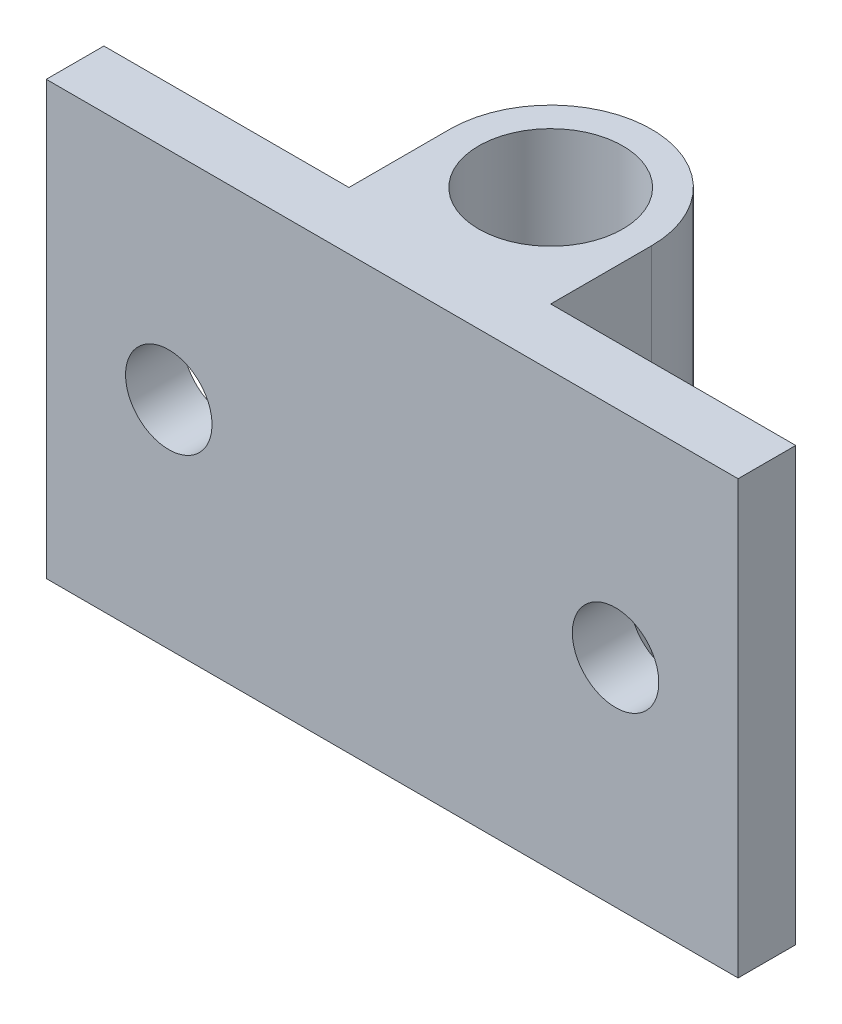
ISO-10303-21;
HEADER;
FILE_DESCRIPTION(('STEP AP214'),'2;1');
FILE_NAME('part.step','',(''),(''),'','','');
FILE_SCHEMA(('AUTOMOTIVE_DESIGN { 1 0 10303 214 1 1 1 1 }'));
ENDSEC;
DATA;
#1=APPLICATION_CONTEXT('core data for automotive mechanical design processes');
#2=APPLICATION_PROTOCOL_DEFINITION('international standard','automotive_design',2000,#1);
#3=PRODUCT_CONTEXT('',#1,'mechanical');
#4=PRODUCT('Part','Part','',(#3));
#5=PRODUCT_RELATED_PRODUCT_CATEGORY('part','',(#4));
#6=PRODUCT_DEFINITION_FORMATION('','',#4);
#7=PRODUCT_DEFINITION_CONTEXT('part definition',#1,'design');
#8=PRODUCT_DEFINITION('design','',#6,#7);
#9=PRODUCT_DEFINITION_SHAPE('','',#8);
#10=(LENGTH_UNIT() NAMED_UNIT(*) SI_UNIT(.MILLI.,.METRE.));
#11=(NAMED_UNIT(*) PLANE_ANGLE_UNIT() SI_UNIT($,.RADIAN.));
#12=(NAMED_UNIT(*) SI_UNIT($,.STERADIAN.) SOLID_ANGLE_UNIT());
#13=UNCERTAINTY_MEASURE_WITH_UNIT(LENGTH_MEASURE(1.E-05),#10,'distance_accuracy_value','');
#14=(GEOMETRIC_REPRESENTATION_CONTEXT(3) GLOBAL_UNCERTAINTY_ASSIGNED_CONTEXT((#13)) GLOBAL_UNIT_ASSIGNED_CONTEXT((#10,
#11,#12)) REPRESENTATION_CONTEXT('',''));
#15=CARTESIAN_POINT('',(0.,0.,0.));
#16=DIRECTION('',(0.,0.,1.));
#17=DIRECTION('',(1.,0.,0.));
#18=AXIS2_PLACEMENT_3D('',#15,#16,#17);
#19=CARTESIAN_POINT('',(0.,15.,0.));
#20=DIRECTION('',(0.,-1.,0.));
#21=DIRECTION('',(0.,0.,-1.));
#22=AXIS2_PLACEMENT_3D('',#19,#20,#21);
#23=CYLINDRICAL_SURFACE('',#22,3.5);
#24=CARTESIAN_POINT('',(0.,0.,0.));
#25=DIRECTION('',(0.,1.,0.));
#26=DIRECTION('',(0.,0.,1.));
#27=AXIS2_PLACEMENT_3D('',#24,#25,#26);
#28=CIRCLE('',#27,3.5);
#29=CARTESIAN_POINT('',(-3.5,0.,0.));
#30=VERTEX_POINT('',#29);
#31=CARTESIAN_POINT('',(3.5,0.,0.));
#32=VERTEX_POINT('',#31);
#33=EDGE_CURVE('E132',#30,#32,#28,.F.);
#34=ORIENTED_EDGE('',*,*,#33,.F.);
#35=DIRECTION('',(0.,-1.,0.));
#36=VECTOR('',#35,1.);
#37=CARTESIAN_POINT('',(-3.5,15.,0.));
#38=LINE('',#37,#36);
#39=CARTESIAN_POINT('',(-3.5,15.,0.));
#40=VERTEX_POINT('',#39);
#41=EDGE_CURVE('E11',#40,#30,#38,.T.);
#42=ORIENTED_EDGE('',*,*,#41,.F.);
#43=CARTESIAN_POINT('',(0.,15.,0.));
#44=DIRECTION('',(0.,1.,0.));
#45=DIRECTION('',(0.,0.,1.));
#46=AXIS2_PLACEMENT_3D('',#43,#44,#45);
#47=CIRCLE('',#46,3.5);
#48=CARTESIAN_POINT('',(3.5,15.,0.));
#49=VERTEX_POINT('',#48);
#50=EDGE_CURVE('E154',#40,#49,#47,.F.);
#51=ORIENTED_EDGE('',*,*,#50,.T.);
#52=DIRECTION('',(0.,-1.,0.));
#53=VECTOR('',#52,1.);
#54=CARTESIAN_POINT('',(3.5,15.,0.));
#55=LINE('',#54,#53);
#56=EDGE_CURVE('E49',#49,#32,#55,.T.);
#57=ORIENTED_EDGE('',*,*,#56,.T.);
#58=EDGE_LOOP('',(#34,#42,#51,#57));
#59=FACE_BOUND('',#58,.T.);
#60=ADVANCED_FACE('F33',(#59),#23,.T.);
#61=CARTESIAN_POINT('',(-3.5,15.,0.));
#62=DIRECTION('',(1.,0.,0.));
#63=DIRECTION('',(0.,0.,-1.));
#64=AXIS2_PLACEMENT_3D('',#61,#62,#63);
#65=PLANE('',#64);
#66=DIRECTION('',(0.,0.,1.));
#67=VECTOR('',#66,1.);
#68=CARTESIAN_POINT('',(-3.5,0.,0.));
#69=LINE('',#68,#67);
#70=CARTESIAN_POINT('',(-3.5,0.,3.5));
#71=VERTEX_POINT('',#70);
#72=EDGE_CURVE('E134',#30,#71,#69,.T.);
#73=ORIENTED_EDGE('',*,*,#72,.T.);
#74=DIRECTION('',(0.,-1.,0.));
#75=VECTOR('',#74,1.);
#76=CARTESIAN_POINT('',(-3.5,15.,3.5));
#77=LINE('',#76,#75);
#78=CARTESIAN_POINT('',(-3.5,15.,3.5));
#79=VERTEX_POINT('',#78);
#80=EDGE_CURVE('E41',#79,#71,#77,.T.);
#81=ORIENTED_EDGE('',*,*,#80,.F.);
#82=DIRECTION('',(0.,0.,1.));
#83=VECTOR('',#82,1.);
#84=CARTESIAN_POINT('',(-3.5,15.,0.));
#85=LINE('',#84,#83);
#86=EDGE_CURVE('E181',#40,#79,#85,.T.);
#87=ORIENTED_EDGE('',*,*,#86,.F.);
#88=ORIENTED_EDGE('',*,*,#41,.T.);
#89=EDGE_LOOP('',(#73,#81,#87,#88));
#90=FACE_BOUND('',#89,.T.);
#91=ADVANCED_FACE('F219',(#90),#65,.F.);
#92=CARTESIAN_POINT('',(0.,15.,3.5));
#93=DIRECTION('',(0.,0.,1.));
#94=DIRECTION('',(1.,0.,0.));
#95=AXIS2_PLACEMENT_3D('',#92,#93,#94);
#96=PLANE('',#95);
#97=CARTESIAN_POINT('',(-7.75,7.5,3.5));
#98=DIRECTION('',(0.,0.,-1.));
#99=DIRECTION('',(-1.,0.,0.));
#100=AXIS2_PLACEMENT_3D('',#97,#98,#99);
#101=CIRCLE('',#100,1.5);
#102=CARTESIAN_POINT('',(-9.25,7.5,3.5));
#103=VERTEX_POINT('',#102);
#104=EDGE_CURVE('E186',#103,#103,#101,.T.);
#105=ORIENTED_EDGE('',*,*,#104,.F.);
#106=EDGE_LOOP('',(#105));
#107=FACE_BOUND('',#106,.T.);
#108=DIRECTION('',(-1.,0.,0.));
#109=VECTOR('',#108,1.);
#110=CARTESIAN_POINT('',(0.,0.,3.5));
#111=LINE('',#110,#109);
#112=CARTESIAN_POINT('',(-12.,0.,3.5));
#113=VERTEX_POINT('',#112);
#114=EDGE_CURVE('E137',#71,#113,#111,.T.);
#115=ORIENTED_EDGE('',*,*,#114,.T.);
#116=DIRECTION('',(0.,-1.,0.));
#117=VECTOR('',#116,1.);
#118=CARTESIAN_POINT('',(-12.,15.,3.5));
#119=LINE('',#118,#117);
#120=CARTESIAN_POINT('',(-12.,15.,3.5));
#121=VERTEX_POINT('',#120);
#122=EDGE_CURVE('E160',#121,#113,#119,.T.);
#123=ORIENTED_EDGE('',*,*,#122,.F.);
#124=DIRECTION('',(-1.,0.,0.));
#125=VECTOR('',#124,1.);
#126=CARTESIAN_POINT('',(0.,15.,3.5));
#127=LINE('',#126,#125);
#128=EDGE_CURVE('E168',#79,#121,#127,.T.);
#129=ORIENTED_EDGE('',*,*,#128,.F.);
#130=ORIENTED_EDGE('',*,*,#80,.T.);
#131=EDGE_LOOP('',(#115,#123,#129,#130));
#132=FACE_BOUND('',#131,.T.);
#133=ADVANCED_FACE('F166',(#107,#132),#96,.F.);
#134=CARTESIAN_POINT('',(-12.,15.,0.));
#135=DIRECTION('',(-1.,0.,0.));
#136=DIRECTION('',(0.,0.,1.));
#137=AXIS2_PLACEMENT_3D('',#134,#135,#136);
#138=PLANE('',#137);
#139=DIRECTION('',(0.,0.,-1.));
#140=VECTOR('',#139,1.);
#141=CARTESIAN_POINT('',(-12.,0.,0.));
#142=LINE('',#141,#140);
#143=CARTESIAN_POINT('',(-12.,0.,5.5));
#144=VERTEX_POINT('',#143);
#145=EDGE_CURVE('E140',#144,#113,#142,.T.);
#146=ORIENTED_EDGE('',*,*,#145,.F.);
#147=DIRECTION('',(0.,-1.,0.));
#148=VECTOR('',#147,1.);
#149=CARTESIAN_POINT('',(-12.,15.,5.5));
#150=LINE('',#149,#148);
#151=CARTESIAN_POINT('',(-12.,15.,5.5));
#152=VERTEX_POINT('',#151);
#153=EDGE_CURVE('E158',#152,#144,#150,.T.);
#154=ORIENTED_EDGE('',*,*,#153,.F.);
#155=DIRECTION('',(0.,0.,-1.));
#156=VECTOR('',#155,1.);
#157=CARTESIAN_POINT('',(-12.,15.,0.));
#158=LINE('',#157,#156);
#159=EDGE_CURVE('E179',#152,#121,#158,.T.);
#160=ORIENTED_EDGE('',*,*,#159,.T.);
#161=ORIENTED_EDGE('',*,*,#122,.T.);
#162=EDGE_LOOP('',(#146,#154,#160,#161));
#163=FACE_BOUND('',#162,.T.);
#164=ADVANCED_FACE('F177',(#163),#138,.T.);
#165=CARTESIAN_POINT('',(0.,15.,5.5));
#166=DIRECTION('',(0.,0.,-1.));
#167=DIRECTION('',(-1.,0.,0.));
#168=AXIS2_PLACEMENT_3D('',#165,#166,#167);
#169=PLANE('',#168);
#170=CARTESIAN_POINT('',(7.75,7.5,5.50000000000001));
#171=DIRECTION('',(0.,0.,-1.));
#172=DIRECTION('',(-1.,0.,0.));
#173=AXIS2_PLACEMENT_3D('',#170,#171,#172);
#174=CIRCLE('',#173,1.5);
#175=CARTESIAN_POINT('',(6.25,7.5,5.50000000000001));
#176=VERTEX_POINT('',#175);
#177=EDGE_CURVE('E135',#176,#176,#174,.T.);
#178=ORIENTED_EDGE('',*,*,#177,.T.);
#179=EDGE_LOOP('',(#178));
#180=FACE_BOUND('',#179,.T.);
#181=CARTESIAN_POINT('',(-7.75,7.5,5.5));
#182=DIRECTION('',(0.,0.,-1.));
#183=DIRECTION('',(-1.,0.,0.));
#184=AXIS2_PLACEMENT_3D('',#181,#182,#183);
#185=CIRCLE('',#184,1.5);
#186=CARTESIAN_POINT('',(-9.25,7.5,5.5));
#187=VERTEX_POINT('',#186);
#188=EDGE_CURVE('E189',#187,#187,#185,.T.);
#189=ORIENTED_EDGE('',*,*,#188,.T.);
#190=EDGE_LOOP('',(#189));
#191=FACE_BOUND('',#190,.T.);
#192=DIRECTION('',(1.,0.,0.));
#193=VECTOR('',#192,1.);
#194=CARTESIAN_POINT('',(0.,0.,5.5));
#195=LINE('',#194,#193);
#196=CARTESIAN_POINT('',(12.,0.,5.5));
#197=VERTEX_POINT('',#196);
#198=EDGE_CURVE('E143',#144,#197,#195,.T.);
#199=ORIENTED_EDGE('',*,*,#198,.T.);
#200=DIRECTION('',(0.,-1.,0.));
#201=VECTOR('',#200,1.);
#202=CARTESIAN_POINT('',(12.,15.,5.5));
#203=LINE('',#202,#201);
#204=CARTESIAN_POINT('',(12.,15.,5.5));
#205=VERTEX_POINT('',#204);
#206=EDGE_CURVE('E121',#205,#197,#203,.T.);
#207=ORIENTED_EDGE('',*,*,#206,.F.);
#208=DIRECTION('',(1.,0.,0.));
#209=VECTOR('',#208,1.);
#210=CARTESIAN_POINT('',(0.,15.,5.5));
#211=LINE('',#210,#209);
#212=EDGE_CURVE('E109',#152,#205,#211,.T.);
#213=ORIENTED_EDGE('',*,*,#212,.F.);
#214=ORIENTED_EDGE('',*,*,#153,.T.);
#215=EDGE_LOOP('',(#199,#207,#213,#214));
#216=FACE_BOUND('',#215,.T.);
#217=ADVANCED_FACE('F198',(#180,#191,#216),#169,.F.);
#218=CARTESIAN_POINT('',(12.,15.,0.));
#219=DIRECTION('',(-1.,0.,0.));
#220=DIRECTION('',(0.,0.,1.));
#221=AXIS2_PLACEMENT_3D('',#218,#219,#220);
#222=PLANE('',#221);
#223=DIRECTION('',(0.,0.,-1.));
#224=VECTOR('',#223,1.);
#225=CARTESIAN_POINT('',(12.,0.,0.));
#226=LINE('',#225,#224);
#227=CARTESIAN_POINT('',(12.,0.,3.5));
#228=VERTEX_POINT('',#227);
#229=EDGE_CURVE('E118',#197,#228,#226,.T.);
#230=ORIENTED_EDGE('',*,*,#229,.T.);
#231=DIRECTION('',(0.,-1.,0.));
#232=VECTOR('',#231,1.);
#233=CARTESIAN_POINT('',(12.,15.,3.5));
#234=LINE('',#233,#232);
#235=CARTESIAN_POINT('',(12.,15.,3.5));
#236=VERTEX_POINT('',#235);
#237=EDGE_CURVE('E115',#236,#228,#234,.T.);
#238=ORIENTED_EDGE('',*,*,#237,.F.);
#239=DIRECTION('',(0.,0.,-1.));
#240=VECTOR('',#239,1.);
#241=CARTESIAN_POINT('',(12.,15.,0.));
#242=LINE('',#241,#240);
#243=EDGE_CURVE('E99',#205,#236,#242,.T.);
#244=ORIENTED_EDGE('',*,*,#243,.F.);
#245=ORIENTED_EDGE('',*,*,#206,.T.);
#246=EDGE_LOOP('',(#230,#238,#244,#245));
#247=FACE_BOUND('',#246,.T.);
#248=ADVANCED_FACE('F116',(#247),#222,.F.);
#249=CARTESIAN_POINT('',(0.,15.,3.5));
#250=DIRECTION('',(0.,0.,1.));
#251=DIRECTION('',(1.,0.,0.));
#252=AXIS2_PLACEMENT_3D('',#249,#250,#251);
#253=PLANE('',#252);
#254=CARTESIAN_POINT('',(7.75,7.5,3.50000000000001));
#255=DIRECTION('',(0.,0.,-1.));
#256=DIRECTION('',(-1.,0.,0.));
#257=AXIS2_PLACEMENT_3D('',#254,#255,#256);
#258=CIRCLE('',#257,1.5);
#259=CARTESIAN_POINT('',(6.25,7.5,3.50000000000001));
#260=VERTEX_POINT('',#259);
#261=EDGE_CURVE('E192',#260,#260,#258,.T.);
#262=ORIENTED_EDGE('',*,*,#261,.F.);
#263=EDGE_LOOP('',(#262));
#264=FACE_BOUND('',#263,.T.);
#265=DIRECTION('',(-1.,0.,0.));
#266=VECTOR('',#265,1.);
#267=CARTESIAN_POINT('',(0.,0.,3.5));
#268=LINE('',#267,#266);
#269=CARTESIAN_POINT('',(3.5,0.,3.5));
#270=VERTEX_POINT('',#269);
#271=EDGE_CURVE('E146',#228,#270,#268,.T.);
#272=ORIENTED_EDGE('',*,*,#271,.T.);
#273=DIRECTION('',(0.,-1.,0.));
#274=VECTOR('',#273,1.);
#275=CARTESIAN_POINT('',(3.5,15.,3.5));
#276=LINE('',#275,#274);
#277=CARTESIAN_POINT('',(3.5,15.,3.5));
#278=VERTEX_POINT('',#277);
#279=EDGE_CURVE('E75',#278,#270,#276,.T.);
#280=ORIENTED_EDGE('',*,*,#279,.F.);
#281=DIRECTION('',(-1.,0.,0.));
#282=VECTOR('',#281,1.);
#283=CARTESIAN_POINT('',(0.,15.,3.5));
#284=LINE('',#283,#282);
#285=EDGE_CURVE('E106',#236,#278,#284,.T.);
#286=ORIENTED_EDGE('',*,*,#285,.F.);
#287=ORIENTED_EDGE('',*,*,#237,.T.);
#288=EDGE_LOOP('',(#272,#280,#286,#287));
#289=FACE_BOUND('',#288,.T.);
#290=ADVANCED_FACE('F123',(#264,#289),#253,.F.);
#291=CARTESIAN_POINT('',(3.5,15.,0.));
#292=DIRECTION('',(1.,0.,0.));
#293=DIRECTION('',(0.,0.,-1.));
#294=AXIS2_PLACEMENT_3D('',#291,#292,#293);
#295=PLANE('',#294);
#296=DIRECTION('',(0.,0.,1.));
#297=VECTOR('',#296,1.);
#298=CARTESIAN_POINT('',(3.5,0.,0.));
#299=LINE('',#298,#297);
#300=EDGE_CURVE('E148',#32,#270,#299,.T.);
#301=ORIENTED_EDGE('',*,*,#300,.F.);
#302=ORIENTED_EDGE('',*,*,#56,.F.);
#303=DIRECTION('',(0.,0.,1.));
#304=VECTOR('',#303,1.);
#305=CARTESIAN_POINT('',(3.5,15.,0.));
#306=LINE('',#305,#304);
#307=EDGE_CURVE('E124',#49,#278,#306,.T.);
#308=ORIENTED_EDGE('',*,*,#307,.T.);
#309=ORIENTED_EDGE('',*,*,#279,.T.);
#310=EDGE_LOOP('',(#301,#302,#308,#309));
#311=FACE_BOUND('',#310,.T.);
#312=ADVANCED_FACE('F209',(#311),#295,.T.);
#313=CARTESIAN_POINT('',(0.,15.,0.));
#314=DIRECTION('',(0.,-1.,0.));
#315=DIRECTION('',(0.,0.,-1.));
#316=AXIS2_PLACEMENT_3D('',#313,#314,#315);
#317=CYLINDRICAL_SURFACE('',#316,2.5);
#318=CARTESIAN_POINT('',(0.,15.,0.));
#319=DIRECTION('',(0.,1.,0.));
#320=DIRECTION('',(0.,0.,1.));
#321=AXIS2_PLACEMENT_3D('',#318,#319,#320);
#322=CIRCLE('',#321,2.5);
#323=CARTESIAN_POINT('',(0.,15.,2.5));
#324=VERTEX_POINT('',#323);
#325=EDGE_CURVE('E126',#324,#324,#322,.T.);
#326=ORIENTED_EDGE('',*,*,#325,.T.);
#327=EDGE_LOOP('',(#326));
#328=FACE_BOUND('',#327,.T.);
#329=CARTESIAN_POINT('',(0.,0.,0.));
#330=DIRECTION('',(0.,1.,0.));
#331=DIRECTION('',(0.,0.,1.));
#332=AXIS2_PLACEMENT_3D('',#329,#330,#331);
#333=CIRCLE('',#332,2.5);
#334=CARTESIAN_POINT('',(0.,0.,2.5));
#335=VERTEX_POINT('',#334);
#336=EDGE_CURVE('E151',#335,#335,#333,.T.);
#337=ORIENTED_EDGE('',*,*,#336,.F.);
#338=EDGE_LOOP('',(#337));
#339=FACE_BOUND('',#338,.T.);
#340=ADVANCED_FACE('F215',(#328,#339),#317,.F.);
#341=CARTESIAN_POINT('',(0.,15.,0.));
#342=DIRECTION('',(0.,1.,0.));
#343=DIRECTION('',(0.,0.,1.));
#344=AXIS2_PLACEMENT_3D('',#341,#342,#343);
#345=PLANE('',#344);
#346=ORIENTED_EDGE('',*,*,#50,.F.);
#347=ORIENTED_EDGE('',*,*,#86,.T.);
#348=ORIENTED_EDGE('',*,*,#128,.T.);
#349=ORIENTED_EDGE('',*,*,#159,.F.);
#350=ORIENTED_EDGE('',*,*,#212,.T.);
#351=ORIENTED_EDGE('',*,*,#243,.T.);
#352=ORIENTED_EDGE('',*,*,#285,.T.);
#353=ORIENTED_EDGE('',*,*,#307,.F.);
#354=EDGE_LOOP('',(#346,#347,#348,#349,#350,#351,#352,#353));
#355=FACE_BOUND('',#354,.T.);
#356=ORIENTED_EDGE('',*,*,#325,.F.);
#357=EDGE_LOOP('',(#356));
#358=FACE_BOUND('',#357,.T.);
#359=ADVANCED_FACE('F102',(#355,#358),#345,.T.);
#360=CARTESIAN_POINT('',(0.,0.,0.));
#361=DIRECTION('',(0.,1.,0.));
#362=DIRECTION('',(0.,0.,1.));
#363=AXIS2_PLACEMENT_3D('',#360,#361,#362);
#364=PLANE('',#363);
#365=ORIENTED_EDGE('',*,*,#33,.T.);
#366=ORIENTED_EDGE('',*,*,#300,.T.);
#367=ORIENTED_EDGE('',*,*,#271,.F.);
#368=ORIENTED_EDGE('',*,*,#229,.F.);
#369=ORIENTED_EDGE('',*,*,#198,.F.);
#370=ORIENTED_EDGE('',*,*,#145,.T.);
#371=ORIENTED_EDGE('',*,*,#114,.F.);
#372=ORIENTED_EDGE('',*,*,#72,.F.);
#373=EDGE_LOOP('',(#365,#366,#367,#368,#369,#370,#371,#372));
#374=FACE_BOUND('',#373,.T.);
#375=ORIENTED_EDGE('',*,*,#336,.T.);
#376=EDGE_LOOP('',(#375));
#377=FACE_BOUND('',#376,.T.);
#378=ADVANCED_FACE('F172',(#374,#377),#364,.F.);
#379=CARTESIAN_POINT('',(7.75,7.5,5.50000000000001));
#380=DIRECTION('',(0.,0.,-1.));
#381=DIRECTION('',(-1.,0.,0.));
#382=AXIS2_PLACEMENT_3D('',#379,#380,#381);
#383=CYLINDRICAL_SURFACE('',#382,1.5);
#384=ORIENTED_EDGE('',*,*,#177,.F.);
#385=EDGE_LOOP('',(#384));
#386=FACE_BOUND('',#385,.T.);
#387=ORIENTED_EDGE('',*,*,#261,.T.);
#388=EDGE_LOOP('',(#387));
#389=FACE_BOUND('',#388,.T.);
#390=ADVANCED_FACE('F201',(#386,#389),#383,.F.);
#391=CARTESIAN_POINT('',(-7.75,7.5,5.5));
#392=DIRECTION('',(0.,0.,-1.));
#393=DIRECTION('',(-1.,0.,0.));
#394=AXIS2_PLACEMENT_3D('',#391,#392,#393);
#395=CYLINDRICAL_SURFACE('',#394,1.5);
#396=ORIENTED_EDGE('',*,*,#188,.F.);
#397=EDGE_LOOP('',(#396));
#398=FACE_BOUND('',#397,.T.);
#399=ORIENTED_EDGE('',*,*,#104,.T.);
#400=EDGE_LOOP('',(#399));
#401=FACE_BOUND('',#400,.T.);
#402=ADVANCED_FACE('F204',(#398,#401),#395,.F.);
#403=CLOSED_SHELL('',(#60,#91,#133,#164,#217,#248,#290,#312,#340,#359,#378,#390,#402));
#404=MANIFOLD_SOLID_BREP('B2',#403);
#405=ADVANCED_BREP_SHAPE_REPRESENTATION('',(#18,#404),#14);
#406=SHAPE_DEFINITION_REPRESENTATION(#9,#405);
ENDSEC;
END-ISO-10303-21;
